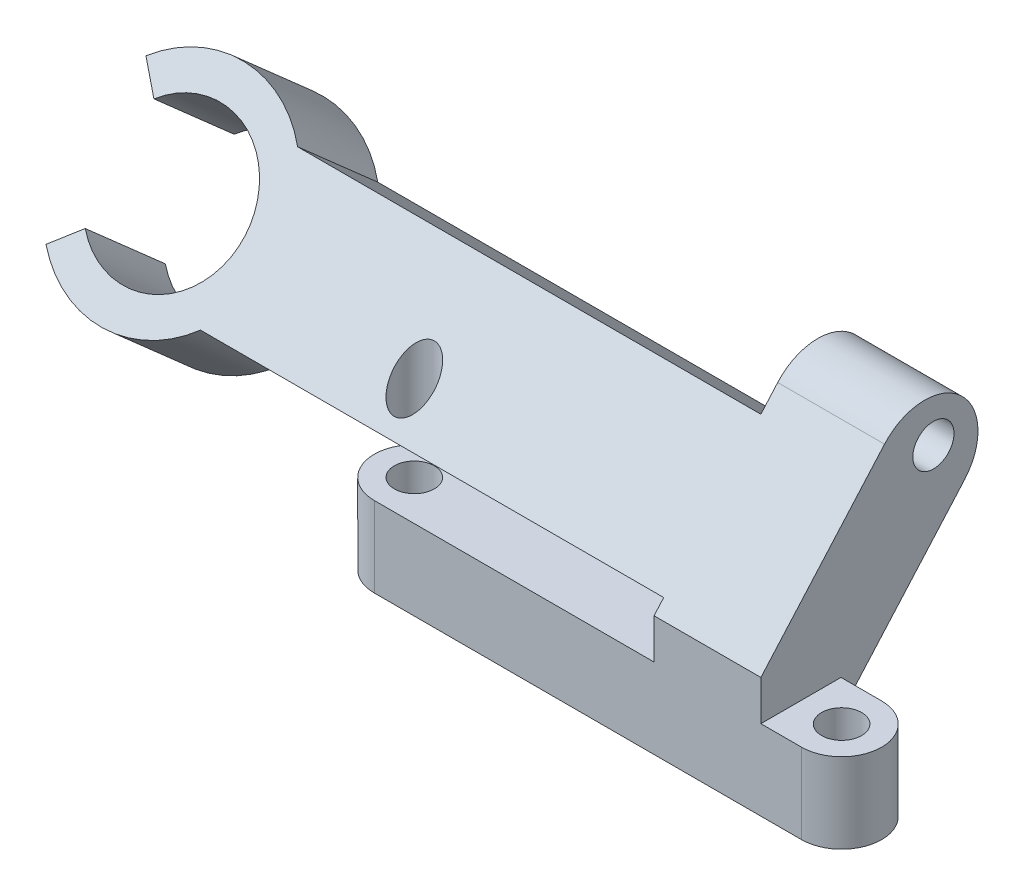
ISO-10303-21;
HEADER;
FILE_DESCRIPTION(('STEP AP214'),'2;1');
FILE_NAME('part.step','',(''),(''),'','','');
FILE_SCHEMA(('AUTOMOTIVE_DESIGN { 1 0 10303 214 1 1 1 1 }'));
ENDSEC;
DATA;
#1=APPLICATION_CONTEXT('core data for automotive mechanical design processes');
#2=APPLICATION_PROTOCOL_DEFINITION('international standard','automotive_design',2000,#1);
#3=PRODUCT_CONTEXT('',#1,'mechanical');
#4=PRODUCT('Part','Part','',(#3));
#5=PRODUCT_RELATED_PRODUCT_CATEGORY('part','',(#4));
#6=PRODUCT_DEFINITION_FORMATION('','',#4);
#7=PRODUCT_DEFINITION_CONTEXT('part definition',#1,'design');
#8=PRODUCT_DEFINITION('design','',#6,#7);
#9=PRODUCT_DEFINITION_SHAPE('','',#8);
#10=(LENGTH_UNIT() NAMED_UNIT(*) SI_UNIT(.MILLI.,.METRE.));
#11=(NAMED_UNIT(*) PLANE_ANGLE_UNIT() SI_UNIT($,.RADIAN.));
#12=(NAMED_UNIT(*) SI_UNIT($,.STERADIAN.) SOLID_ANGLE_UNIT());
#13=UNCERTAINTY_MEASURE_WITH_UNIT(LENGTH_MEASURE(1.E-05),#10,'distance_accuracy_value','');
#14=(GEOMETRIC_REPRESENTATION_CONTEXT(3) GLOBAL_UNCERTAINTY_ASSIGNED_CONTEXT((#13)) GLOBAL_UNIT_ASSIGNED_CONTEXT((#10,
#11,#12)) REPRESENTATION_CONTEXT('',''));
#15=CARTESIAN_POINT('',(0.,0.,0.));
#16=DIRECTION('',(0.,0.,1.));
#17=DIRECTION('',(1.,0.,0.));
#18=AXIS2_PLACEMENT_3D('',#15,#16,#17);
#19=CARTESIAN_POINT('',(0.,-6.,-3.));
#20=DIRECTION('',(0.,0.,1.));
#21=DIRECTION('',(1.,0.,0.));
#22=AXIS2_PLACEMENT_3D('',#19,#20,#21);
#23=PLANE('',#22);
#24=DIRECTION('',(-1.,0.,0.));
#25=VECTOR('',#24,1.);
#26=CARTESIAN_POINT('',(0.,-0.833438766914098,-3.));
#27=LINE('',#26,#25);
#28=CARTESIAN_POINT('',(-17.7227582561547,-0.833438766914098,-3.));
#29=VERTEX_POINT('',#28);
#30=CARTESIAN_POINT('',(-38.6769688873375,-0.833438766914098,-3.));
#31=VERTEX_POINT('',#30);
#32=EDGE_CURVE('E235',#29,#31,#27,.T.);
#33=ORIENTED_EDGE('',*,*,#32,.F.);
#34=DIRECTION('',(0.,1.,0.));
#35=VECTOR('',#34,1.);
#36=CARTESIAN_POINT('',(-17.7227582561547,-6.,-3.));
#37=LINE('',#36,#35);
#38=CARTESIAN_POINT('',(-17.7227582561547,-2.2915026221292,-3.));
#39=VERTEX_POINT('',#38);
#40=EDGE_CURVE('E272',#39,#29,#37,.T.);
#41=ORIENTED_EDGE('',*,*,#40,.F.);
#42=DIRECTION('',(1.,0.,0.));
#43=VECTOR('',#42,1.);
#44=CARTESIAN_POINT('',(-17.7227582561547,-2.2915026221292,-3.));
#45=LINE('',#44,#43);
#46=CARTESIAN_POINT('',(-9.72275825615475,-2.2915026221292,-3.));
#47=VERTEX_POINT('',#46);
#48=EDGE_CURVE('E249',#39,#47,#45,.T.);
#49=ORIENTED_EDGE('',*,*,#48,.T.);
#50=DIRECTION('',(0.,1.,0.));
#51=VECTOR('',#50,1.);
#52=CARTESIAN_POINT('',(-9.72275825615475,-6.,-3.));
#53=LINE('',#52,#51);
#54=CARTESIAN_POINT('',(-9.72275825615475,0.,-3.));
#55=VERTEX_POINT('',#54);
#56=EDGE_CURVE('E252',#47,#55,#53,.T.);
#57=ORIENTED_EDGE('',*,*,#56,.T.);
#58=DIRECTION('',(1.,0.,0.));
#59=VECTOR('',#58,1.);
#60=CARTESIAN_POINT('',(0.,0.,-3.));
#61=LINE('',#60,#59);
#62=CARTESIAN_POINT('',(-6.67696888733747,0.,-3.));
#63=VERTEX_POINT('',#62);
#64=EDGE_CURVE('E321',#55,#63,#61,.T.);
#65=ORIENTED_EDGE('',*,*,#64,.T.);
#66=DIRECTION('',(0.,1.,0.));
#67=VECTOR('',#66,1.);
#68=CARTESIAN_POINT('',(-6.67696888733747,-6.,-3.));
#69=LINE('',#68,#67);
#70=CARTESIAN_POINT('',(-6.67696888733747,-6.,-3.));
#71=VERTEX_POINT('',#70);
#72=EDGE_CURVE('E339',#71,#63,#69,.T.);
#73=ORIENTED_EDGE('',*,*,#72,.F.);
#74=DIRECTION('',(1.,0.,0.));
#75=VECTOR('',#74,1.);
#76=CARTESIAN_POINT('',(0.,-6.,-3.));
#77=LINE('',#76,#75);
#78=CARTESIAN_POINT('',(-38.6769688873375,-6.,-3.));
#79=VERTEX_POINT('',#78);
#80=EDGE_CURVE('E356',#79,#71,#77,.T.);
#81=ORIENTED_EDGE('',*,*,#80,.F.);
#82=DIRECTION('',(0.,1.,0.));
#83=VECTOR('',#82,1.);
#84=CARTESIAN_POINT('',(-38.6769688873375,-6.,-3.));
#85=LINE('',#84,#83);
#86=EDGE_CURVE('E336',#79,#31,#85,.T.);
#87=ORIENTED_EDGE('',*,*,#86,.T.);
#88=EDGE_LOOP('',(#33,#41,#49,#57,#65,#73,#81,#87));
#89=FACE_BOUND('',#88,.T.);
#90=ADVANCED_FACE('F53',(#89),#23,.F.);
#91=CARTESIAN_POINT('',(-38.6769688873375,-6.,0.));
#92=DIRECTION('',(0.,1.,0.));
#93=DIRECTION('',(0.,0.,1.));
#94=AXIS2_PLACEMENT_3D('',#91,#92,#93);
#95=CYLINDRICAL_SURFACE('',#94,3.);
#96=CARTESIAN_POINT('',(-38.6769688873375,0.,0.));
#97=DIRECTION('',(0.,1.,0.));
#98=DIRECTION('',(0.,0.,1.));
#99=AXIS2_PLACEMENT_3D('',#96,#97,#98);
#100=CIRCLE('',#99,3.);
#101=CARTESIAN_POINT('',(-40.8626269830943,0.,-2.05496926703356));
#102=VERTEX_POINT('',#101);
#103=CARTESIAN_POINT('',(-38.6769688873375,0.,3.));
#104=VERTEX_POINT('',#103);
#105=EDGE_CURVE('E313',#102,#104,#100,.T.);
#106=ORIENTED_EDGE('',*,*,#105,.F.);
#107=CARTESIAN_POINT('',(-38.6769688873375,1.8123125441505,0.));
#108=DIRECTION('',(0.,0.749999999999999,-0.661437827766149));
#109=DIRECTION('',(0.,0.661437827766149,0.749999999999999));
#110=AXIS2_PLACEMENT_3D('',#107,#108,#109);
#111=ELLIPSE('',#110,4.00000000000001,3.);
#112=EDGE_CURVE('E233',#102,#31,#111,.F.);
#113=ORIENTED_EDGE('',*,*,#112,.T.);
#114=ORIENTED_EDGE('',*,*,#86,.F.);
#115=CARTESIAN_POINT('',(-38.6769688873375,-6.,0.));
#116=DIRECTION('',(0.,1.,0.));
#117=DIRECTION('',(0.,0.,1.));
#118=AXIS2_PLACEMENT_3D('',#115,#116,#117);
#119=CIRCLE('',#118,3.);
#120=CARTESIAN_POINT('',(-38.6769688873375,-6.,3.));
#121=VERTEX_POINT('',#120);
#122=EDGE_CURVE('E353',#79,#121,#119,.T.);
#123=ORIENTED_EDGE('',*,*,#122,.T.);
#124=DIRECTION('',(0.,1.,0.));
#125=VECTOR('',#124,1.);
#126=CARTESIAN_POINT('',(-38.6769688873375,-6.,3.));
#127=LINE('',#126,#125);
#128=EDGE_CURVE('E62',#121,#104,#127,.T.);
#129=ORIENTED_EDGE('',*,*,#128,.T.);
#130=EDGE_LOOP('',(#106,#113,#114,#123,#129));
#131=FACE_BOUND('',#130,.T.);
#132=ADVANCED_FACE('F370',(#131),#95,.T.);
#133=CARTESIAN_POINT('',(0.,0.,0.));
#134=DIRECTION('',(0.,1.,0.));
#135=DIRECTION('',(0.,0.,1.));
#136=AXIS2_PLACEMENT_3D('',#133,#134,#135);
#137=PLANE('',#136);
#138=CARTESIAN_POINT('',(-38.6769688873375,0.,0.));
#139=DIRECTION('',(0.,1.,0.));
#140=DIRECTION('',(0.,0.,1.));
#141=AXIS2_PLACEMENT_3D('',#138,#139,#140);
#142=CIRCLE('',#141,1.5);
#143=CARTESIAN_POINT('',(-38.6769688873375,0.,1.5));
#144=VERTEX_POINT('',#143);
#145=EDGE_CURVE('E328',#144,#144,#142,.T.);
#146=ORIENTED_EDGE('',*,*,#145,.F.);
#147=EDGE_LOOP('',(#146));
#148=FACE_BOUND('',#147,.T.);
#149=DIRECTION('',(0.,0.,1.));
#150=VECTOR('',#149,1.);
#151=CARTESIAN_POINT('',(-17.7227582561547,0.,0.));
#152=LINE('',#151,#150);
#153=CARTESIAN_POINT('',(-17.7227582561547,0.,-2.05496926703356));
#154=VERTEX_POINT('',#153);
#155=CARTESIAN_POINT('',(-17.7227582561547,0.,3.));
#156=VERTEX_POINT('',#155);
#157=EDGE_CURVE('E282',#154,#156,#152,.T.);
#158=ORIENTED_EDGE('',*,*,#157,.F.);
#159=DIRECTION('',(-1.,0.,0.));
#160=VECTOR('',#159,1.);
#161=CARTESIAN_POINT('',(0.,0.,-2.05496926703356));
#162=LINE('',#161,#160);
#163=EDGE_CURVE('E231',#154,#102,#162,.T.);
#164=ORIENTED_EDGE('',*,*,#163,.T.);
#165=ORIENTED_EDGE('',*,*,#105,.T.);
#166=DIRECTION('',(1.,0.,0.));
#167=VECTOR('',#166,1.);
#168=CARTESIAN_POINT('',(0.,0.,3.));
#169=LINE('',#168,#167);
#170=EDGE_CURVE('E310',#104,#156,#169,.T.);
#171=ORIENTED_EDGE('',*,*,#170,.T.);
#172=EDGE_LOOP('',(#158,#164,#165,#171));
#173=FACE_BOUND('',#172,.T.);
#174=ADVANCED_FACE('F311',(#148,#173),#137,.T.);
#175=CARTESIAN_POINT('',(-17.7227582561547,3.,0.));
#176=DIRECTION('',(1.,0.,0.));
#177=DIRECTION('',(0.,0.,-1.));
#178=AXIS2_PLACEMENT_3D('',#175,#176,#177);
#179=PLANE('',#178);
#180=DIRECTION('',(0.,0.661437827766149,0.749999999999999));
#181=VECTOR('',#180,1.);
#182=CARTESIAN_POINT('',(-17.7227582561547,-1.47134170357071,-3.72331394185336));
#183=LINE('',#182,#181);
#184=CARTESIAN_POINT('',(-17.7227582561547,-1.47134170357071,-3.72331394185336));
#185=VERTEX_POINT('',#184);
#186=EDGE_CURVE('E218',#185,#29,#183,.T.);
#187=ORIENTED_EDGE('',*,*,#186,.F.);
#188=DIRECTION('',(0.,-0.749999999999999,0.661437827766149));
#189=VECTOR('',#188,1.);
#190=CARTESIAN_POINT('',(-17.7227582561547,8.20849737787078,-12.2601295887261));
#191=LINE('',#190,#189);
#192=EDGE_CURVE('E258',#185,#39,#191,.T.);
#193=ORIENTED_EDGE('',*,*,#192,.T.);
#194=ORIENTED_EDGE('',*,*,#40,.T.);
#195=EDGE_LOOP('',(#187,#193,#194));
#196=FACE_BOUND('',#195,.T.);
#197=ADVANCED_FACE('F394',(#196),#179,.F.);
#198=CARTESIAN_POINT('',(-17.7227582561547,3.82016091855849,2.27668605814664));
#199=VERTEX_POINT('',#198);
#200=EDGE_CURVE('E216',#154,#199,#183,.T.);
#201=ORIENTED_EDGE('',*,*,#200,.F.);
#202=ORIENTED_EDGE('',*,*,#157,.T.);
#203=DIRECTION('',(0.,-1.,0.));
#204=VECTOR('',#203,1.);
#205=CARTESIAN_POINT('',(-17.7227582561547,3.,3.));
#206=LINE('',#205,#204);
#207=CARTESIAN_POINT('',(-17.7227582561547,3.,3.));
#208=VERTEX_POINT('',#207);
#209=EDGE_CURVE('E294',#208,#156,#206,.T.);
#210=ORIENTED_EDGE('',*,*,#209,.F.);
#211=DIRECTION('',(0.,-0.749999999999999,0.661437827766149));
#212=VECTOR('',#211,1.);
#213=CARTESIAN_POINT('',(-17.7227582561547,13.5,-6.26012958872609));
#214=LINE('',#213,#212);
#215=EDGE_CURVE('E257',#199,#208,#214,.T.);
#216=ORIENTED_EDGE('',*,*,#215,.F.);
#217=EDGE_LOOP('',(#201,#202,#210,#216));
#218=FACE_BOUND('',#217,.T.);
#219=ADVANCED_FACE('F303',(#218),#179,.F.);
#220=CARTESIAN_POINT('',(-17.7227582561547,11.6042486889354,-9.92156741649224));
#221=DIRECTION('',(1.,0.,0.));
#222=DIRECTION('',(0.,0.,-1.));
#223=AXIS2_PLACEMENT_3D('',#220,#221,#222);
#224=CIRCLE('',#223,1.54236434065057);
#225=CARTESIAN_POINT('',(-17.7227582561547,11.6042486889354,-11.4639317571428));
#226=VERTEX_POINT('',#225);
#227=EDGE_CURVE('E241',#226,#226,#224,.T.);
#228=ORIENTED_EDGE('',*,*,#227,.T.);
#229=EDGE_LOOP('',(#228));
#230=FACE_BOUND('',#229,.T.);
#231=DIRECTION('',(0.,-0.661437827766149,-0.749999999999999));
#232=VECTOR('',#231,1.);
#233=CARTESIAN_POINT('',(-17.7227582561547,6.77865829642928,-10.999130047281));
#234=LINE('',#233,#232);
#235=CARTESIAN_POINT('',(-17.7227582561547,12.0701609185585,-4.999130047281));
#236=VERTEX_POINT('',#235);
#237=CARTESIAN_POINT('',(-17.7227582561547,6.77865829642927,-10.999130047281));
#238=VERTEX_POINT('',#237);
#239=EDGE_CURVE('E221',#236,#238,#234,.T.);
#240=ORIENTED_EDGE('',*,*,#239,.F.);
#241=CARTESIAN_POINT('',(-17.7227582561547,13.5,-6.26012958872609));
#242=VERTEX_POINT('',#241);
#243=EDGE_CURVE('E259',#242,#236,#214,.T.);
#244=ORIENTED_EDGE('',*,*,#243,.F.);
#245=CARTESIAN_POINT('',(-17.7227582561547,10.8542486889354,-9.26012958872609));
#246=DIRECTION('',(1.,0.,0.));
#247=DIRECTION('',(0.,0.,-1.));
#248=AXIS2_PLACEMENT_3D('',#245,#246,#247);
#249=CIRCLE('',#248,4.);
#250=CARTESIAN_POINT('',(-17.7227582561547,8.20849737787078,-12.2601295887261));
#251=VERTEX_POINT('',#250);
#252=EDGE_CURVE('E242',#251,#242,#249,.T.);
#253=ORIENTED_EDGE('',*,*,#252,.F.);
#254=EDGE_CURVE('E254',#251,#238,#191,.T.);
#255=ORIENTED_EDGE('',*,*,#254,.T.);
#256=EDGE_LOOP('',(#240,#244,#253,#255));
#257=FACE_BOUND('',#256,.T.);
#258=ADVANCED_FACE('F404',(#230,#257),#179,.F.);
#259=CARTESIAN_POINT('',(-6.67696888733747,0.,0.));
#260=DIRECTION('',(0.,1.,0.));
#261=DIRECTION('',(0.,0.,1.));
#262=AXIS2_PLACEMENT_3D('',#259,#260,#261);
#263=CIRCLE('',#262,1.5);
#264=CARTESIAN_POINT('',(-6.67696888733747,0.,1.5));
#265=VERTEX_POINT('',#264);
#266=EDGE_CURVE('E331',#265,#265,#263,.T.);
#267=ORIENTED_EDGE('',*,*,#266,.F.);
#268=EDGE_LOOP('',(#267));
#269=FACE_BOUND('',#268,.T.);
#270=ORIENTED_EDGE('',*,*,#64,.F.);
#271=DIRECTION('',(0.,0.,1.));
#272=VECTOR('',#271,1.);
#273=CARTESIAN_POINT('',(-9.72275825615475,0.,0.));
#274=LINE('',#273,#272);
#275=CARTESIAN_POINT('',(-9.72275825615475,0.,3.));
#276=VERTEX_POINT('',#275);
#277=EDGE_CURVE('E277',#55,#276,#274,.T.);
#278=ORIENTED_EDGE('',*,*,#277,.T.);
#279=CARTESIAN_POINT('',(-6.67696888733747,0.,3.));
#280=VERTEX_POINT('',#279);
#281=EDGE_CURVE('E317',#276,#280,#169,.T.);
#282=ORIENTED_EDGE('',*,*,#281,.T.);
#283=CARTESIAN_POINT('',(-6.67696888733747,0.,0.));
#284=DIRECTION('',(0.,1.,0.));
#285=DIRECTION('',(0.,0.,1.));
#286=AXIS2_PLACEMENT_3D('',#283,#284,#285);
#287=CIRCLE('',#286,3.);
#288=EDGE_CURVE('E316',#280,#63,#287,.T.);
#289=ORIENTED_EDGE('',*,*,#288,.T.);
#290=EDGE_LOOP('',(#270,#278,#282,#289));
#291=FACE_BOUND('',#290,.T.);
#292=ADVANCED_FACE('F380',(#269,#291),#137,.T.);
#293=CARTESIAN_POINT('',(0.,-6.,3.));
#294=DIRECTION('',(0.,0.,1.));
#295=DIRECTION('',(1.,0.,0.));
#296=AXIS2_PLACEMENT_3D('',#293,#294,#295);
#297=PLANE('',#296);
#298=ORIENTED_EDGE('',*,*,#170,.F.);
#299=ORIENTED_EDGE('',*,*,#128,.F.);
#300=DIRECTION('',(1.,0.,0.));
#301=VECTOR('',#300,1.);
#302=CARTESIAN_POINT('',(0.,-6.,3.));
#303=LINE('',#302,#301);
#304=CARTESIAN_POINT('',(-6.67696888733747,-6.,3.));
#305=VERTEX_POINT('',#304);
#306=EDGE_CURVE('E334',#121,#305,#303,.T.);
#307=ORIENTED_EDGE('',*,*,#306,.T.);
#308=DIRECTION('',(0.,1.,0.));
#309=VECTOR('',#308,1.);
#310=CARTESIAN_POINT('',(-6.67696888733747,-6.,3.));
#311=LINE('',#310,#309);
#312=EDGE_CURVE('E342',#305,#280,#311,.T.);
#313=ORIENTED_EDGE('',*,*,#312,.T.);
#314=ORIENTED_EDGE('',*,*,#281,.F.);
#315=DIRECTION('',(0.,-1.,0.));
#316=VECTOR('',#315,1.);
#317=CARTESIAN_POINT('',(-9.72275825615475,3.,3.));
#318=LINE('',#317,#316);
#319=CARTESIAN_POINT('',(-9.72275825615475,3.,3.));
#320=VERTEX_POINT('',#319);
#321=EDGE_CURVE('E281',#320,#276,#318,.T.);
#322=ORIENTED_EDGE('',*,*,#321,.F.);
#323=DIRECTION('',(1.,0.,0.));
#324=VECTOR('',#323,1.);
#325=CARTESIAN_POINT('',(0.,3.,3.));
#326=LINE('',#325,#324);
#327=EDGE_CURVE('E278',#208,#320,#326,.T.);
#328=ORIENTED_EDGE('',*,*,#327,.F.);
#329=ORIENTED_EDGE('',*,*,#209,.T.);
#330=EDGE_LOOP('',(#298,#299,#307,#313,#314,#322,#328,#329));
#331=FACE_BOUND('',#330,.T.);
#332=ADVANCED_FACE('F55',(#331),#297,.T.);
#333=CARTESIAN_POINT('',(-38.6769688873375,-6.,0.));
#334=DIRECTION('',(0.,1.,0.));
#335=DIRECTION('',(0.,0.,1.));
#336=AXIS2_PLACEMENT_3D('',#333,#334,#335);
#337=CYLINDRICAL_SURFACE('',#336,1.5);
#338=CARTESIAN_POINT('',(-38.6769688873375,-6.,0.));
#339=DIRECTION('',(0.,1.,0.));
#340=DIRECTION('',(0.,0.,1.));
#341=AXIS2_PLACEMENT_3D('',#338,#339,#340);
#342=CIRCLE('',#341,1.5);
#343=CARTESIAN_POINT('',(-38.6769688873375,-6.,1.5));
#344=VERTEX_POINT('',#343);
#345=EDGE_CURVE('E350',#344,#344,#342,.T.);
#346=ORIENTED_EDGE('',*,*,#345,.F.);
#347=EDGE_LOOP('',(#346));
#348=FACE_BOUND('',#347,.T.);
#349=ORIENTED_EDGE('',*,*,#145,.T.);
#350=EDGE_LOOP('',(#349));
#351=FACE_BOUND('',#350,.T.);
#352=ADVANCED_FACE('F456',(#348,#351),#337,.F.);
#353=CARTESIAN_POINT('',(-6.67696888733747,-6.,0.));
#354=DIRECTION('',(0.,1.,0.));
#355=DIRECTION('',(0.,0.,1.));
#356=AXIS2_PLACEMENT_3D('',#353,#354,#355);
#357=CYLINDRICAL_SURFACE('',#356,3.);
#358=ORIENTED_EDGE('',*,*,#288,.F.);
#359=ORIENTED_EDGE('',*,*,#312,.F.);
#360=CARTESIAN_POINT('',(-6.67696888733747,-6.,0.));
#361=DIRECTION('',(0.,1.,0.));
#362=DIRECTION('',(0.,0.,1.));
#363=AXIS2_PLACEMENT_3D('',#360,#361,#362);
#364=CIRCLE('',#363,3.);
#365=EDGE_CURVE('E358',#305,#71,#364,.T.);
#366=ORIENTED_EDGE('',*,*,#365,.T.);
#367=ORIENTED_EDGE('',*,*,#72,.T.);
#368=EDGE_LOOP('',(#358,#359,#366,#367));
#369=FACE_BOUND('',#368,.T.);
#370=ADVANCED_FACE('F378',(#369),#357,.T.);
#371=CARTESIAN_POINT('',(-6.67696888733747,-6.,0.));
#372=DIRECTION('',(0.,1.,0.));
#373=DIRECTION('',(0.,0.,1.));
#374=AXIS2_PLACEMENT_3D('',#371,#372,#373);
#375=CYLINDRICAL_SURFACE('',#374,1.5);
#376=CARTESIAN_POINT('',(-6.67696888733747,-6.,0.));
#377=DIRECTION('',(0.,1.,0.));
#378=DIRECTION('',(0.,0.,1.));
#379=AXIS2_PLACEMENT_3D('',#376,#377,#378);
#380=CIRCLE('',#379,1.5);
#381=CARTESIAN_POINT('',(-6.67696888733747,-6.,1.5));
#382=VERTEX_POINT('',#381);
#383=EDGE_CURVE('E344',#382,#382,#380,.T.);
#384=ORIENTED_EDGE('',*,*,#383,.F.);
#385=EDGE_LOOP('',(#384));
#386=FACE_BOUND('',#385,.T.);
#387=ORIENTED_EDGE('',*,*,#266,.T.);
#388=EDGE_LOOP('',(#387));
#389=FACE_BOUND('',#388,.T.);
#390=ADVANCED_FACE('F455',(#386,#389),#375,.F.);
#391=CARTESIAN_POINT('',(0.,-6.,0.));
#392=DIRECTION('',(0.,1.,0.));
#393=DIRECTION('',(0.,0.,1.));
#394=AXIS2_PLACEMENT_3D('',#391,#392,#393);
#395=PLANE('',#394);
#396=ORIENTED_EDGE('',*,*,#306,.F.);
#397=ORIENTED_EDGE('',*,*,#122,.F.);
#398=ORIENTED_EDGE('',*,*,#80,.T.);
#399=ORIENTED_EDGE('',*,*,#365,.F.);
#400=EDGE_LOOP('',(#396,#397,#398,#399));
#401=FACE_BOUND('',#400,.T.);
#402=ORIENTED_EDGE('',*,*,#345,.T.);
#403=EDGE_LOOP('',(#402));
#404=FACE_BOUND('',#403,.T.);
#405=ORIENTED_EDGE('',*,*,#383,.T.);
#406=EDGE_LOOP('',(#405));
#407=FACE_BOUND('',#406,.T.);
#408=ADVANCED_FACE('F367',(#401,#404,#407),#395,.F.);
#409=CARTESIAN_POINT('',(-9.72275825615475,3.,0.));
#410=DIRECTION('',(1.,0.,0.));
#411=DIRECTION('',(0.,0.,-1.));
#412=AXIS2_PLACEMENT_3D('',#409,#410,#411);
#413=PLANE('',#412);
#414=CARTESIAN_POINT('',(-9.72275825615475,11.6042486889354,-9.92156741649224));
#415=DIRECTION('',(1.,0.,0.));
#416=DIRECTION('',(0.,0.,-1.));
#417=AXIS2_PLACEMENT_3D('',#414,#415,#416);
#418=CIRCLE('',#417,1.54236434065057);
#419=CARTESIAN_POINT('',(-9.72275825615475,11.6042486889354,-11.4639317571428));
#420=VERTEX_POINT('',#419);
#421=EDGE_CURVE('E238',#420,#420,#418,.T.);
#422=ORIENTED_EDGE('',*,*,#421,.F.);
#423=EDGE_LOOP('',(#422));
#424=FACE_BOUND('',#423,.T.);
#425=ORIENTED_EDGE('',*,*,#277,.F.);
#426=ORIENTED_EDGE('',*,*,#56,.F.);
#427=DIRECTION('',(0.,-0.749999999999999,0.661437827766149));
#428=VECTOR('',#427,1.);
#429=CARTESIAN_POINT('',(-9.72275825615475,8.20849737787078,-12.2601295887261));
#430=LINE('',#429,#428);
#431=CARTESIAN_POINT('',(-9.72275825615475,8.20849737787078,-12.2601295887261));
#432=VERTEX_POINT('',#431);
#433=EDGE_CURVE('E262',#432,#47,#430,.T.);
#434=ORIENTED_EDGE('',*,*,#433,.F.);
#435=CARTESIAN_POINT('',(-9.72275825615475,10.8542486889354,-9.26012958872609));
#436=DIRECTION('',(1.,0.,0.));
#437=DIRECTION('',(0.,0.,-1.));
#438=AXIS2_PLACEMENT_3D('',#435,#436,#437);
#439=CIRCLE('',#438,4.);
#440=CARTESIAN_POINT('',(-9.72275825615475,13.5,-6.26012958872609));
#441=VERTEX_POINT('',#440);
#442=EDGE_CURVE('E246',#432,#441,#439,.T.);
#443=ORIENTED_EDGE('',*,*,#442,.T.);
#444=DIRECTION('',(0.,-0.749999999999999,0.661437827766149));
#445=VECTOR('',#444,1.);
#446=CARTESIAN_POINT('',(-9.72275825615475,13.5,-6.26012958872609));
#447=LINE('',#446,#445);
#448=EDGE_CURVE('E265',#441,#320,#447,.T.);
#449=ORIENTED_EDGE('',*,*,#448,.T.);
#450=ORIENTED_EDGE('',*,*,#321,.T.);
#451=EDGE_LOOP('',(#425,#426,#434,#443,#449,#450));
#452=FACE_BOUND('',#451,.T.);
#453=ADVANCED_FACE('F383',(#424,#452),#413,.T.);
#454=CARTESIAN_POINT('',(-17.7227582561547,10.8542486889354,-9.26012958872609));
#455=DIRECTION('',(1.,0.,0.));
#456=DIRECTION('',(0.,0.,-1.));
#457=AXIS2_PLACEMENT_3D('',#454,#455,#456);
#458=CYLINDRICAL_SURFACE('',#457,4.);
#459=ORIENTED_EDGE('',*,*,#442,.F.);
#460=DIRECTION('',(1.,0.,0.));
#461=VECTOR('',#460,1.);
#462=CARTESIAN_POINT('',(-17.7227582561547,8.20849737787078,-12.2601295887261));
#463=LINE('',#462,#461);
#464=EDGE_CURVE('E245',#251,#432,#463,.T.);
#465=ORIENTED_EDGE('',*,*,#464,.F.);
#466=ORIENTED_EDGE('',*,*,#252,.T.);
#467=DIRECTION('',(1.,0.,0.));
#468=VECTOR('',#467,1.);
#469=CARTESIAN_POINT('',(-17.7227582561547,13.5,-6.26012958872609));
#470=LINE('',#469,#468);
#471=EDGE_CURVE('E250',#242,#441,#470,.T.);
#472=ORIENTED_EDGE('',*,*,#471,.T.);
#473=EDGE_LOOP('',(#459,#465,#466,#472));
#474=FACE_BOUND('',#473,.T.);
#475=ADVANCED_FACE('F399',(#474),#458,.T.);
#476=CARTESIAN_POINT('',(-17.7227582561547,13.5,-6.26012958872609));
#477=DIRECTION('',(0.,0.661437827766149,0.749999999999999));
#478=DIRECTION('',(0.,-0.749999999999999,0.661437827766149));
#479=AXIS2_PLACEMENT_3D('',#476,#477,#478);
#480=PLANE('',#479);
#481=CARTESIAN_POINT('',(-38.6769688873375,6.40168025708303,0.));
#482=DIRECTION('',(0.,0.661437827766149,0.749999999999999));
#483=DIRECTION('',(0.,-0.749999999999999,0.661437827766149));
#484=AXIS2_PLACEMENT_3D('',#481,#482,#483);
#485=ELLIPSE('',#484,2.26778683805536,1.5);
#486=CARTESIAN_POINT('',(-38.6769688873375,4.70084012854151,1.5));
#487=VERTEX_POINT('',#486);
#488=EDGE_CURVE('E414',#487,#487,#485,.T.);
#489=ORIENTED_EDGE('',*,*,#488,.F.);
#490=EDGE_LOOP('',(#489));
#491=FACE_BOUND('',#490,.T.);
#492=DIRECTION('',(1.,0.,0.));
#493=VECTOR('',#492,1.);
#494=CARTESIAN_POINT('',(-52.7227582561548,12.0701609185585,-4.999130047281));
#495=LINE('',#494,#493);
#496=CARTESIAN_POINT('',(-52.4132832368436,12.0701609185585,-4.999130047281));
#497=VERTEX_POINT('',#496);
#498=EDGE_CURVE('E226',#497,#236,#495,.T.);
#499=ORIENTED_EDGE('',*,*,#498,.F.);
#500=CARTESIAN_POINT('',(-58.2227582561547,7.94516091855847,-1.36122199456719));
#501=DIRECTION('',(0.,-0.661437827766149,-0.749999999999999));
#502=DIRECTION('',(0.,0.749999999999999,-0.661437827766149));
#503=AXIS2_PLACEMENT_3D('',#500,#501,#502);
#504=CIRCLE('',#503,8.);
#505=CARTESIAN_POINT('',(-63.8796125056471,12.1878016056778,-5.10287938134116));
#506=VERTEX_POINT('',#505);
#507=EDGE_CURVE('E190',#506,#497,#504,.T.);
#508=ORIENTED_EDGE('',*,*,#507,.F.);
#509=DIRECTION('',(-0.707106781186546,0.530330085889911,-0.467707173346745));
#510=VECTOR('',#509,1.);
#511=CARTESIAN_POINT('',(-25.6817619240211,-16.4605863305419,20.1626239327056));
#512=LINE('',#511,#510);
#513=CARTESIAN_POINT('',(-62.1118455526808,10.861976390953,-3.9336114479743));
#514=VERTEX_POINT('',#513);
#515=EDGE_CURVE('E207',#514,#506,#512,.T.);
#516=ORIENTED_EDGE('',*,*,#515,.F.);
#517=CARTESIAN_POINT('',(-58.2227582561547,7.94516091855847,-1.36122199456719));
#518=DIRECTION('',(0.,-0.661437827766149,-0.749999999999999));
#519=DIRECTION('',(0.,0.749999999999999,-0.661437827766149));
#520=AXIS2_PLACEMENT_3D('',#517,#518,#519);
#521=CIRCLE('',#520,5.50000000000001);
#522=CARTESIAN_POINT('',(-62.1118455526808,5.02834544616396,1.2111674588399));
#523=VERTEX_POINT('',#522);
#524=EDGE_CURVE('E198',#514,#523,#521,.T.);
#525=ORIENTED_EDGE('',*,*,#524,.T.);
#526=DIRECTION('',(-0.707106781186547,-0.53033008588991,0.467707173346744));
#527=VECTOR('',#526,1.);
#528=CARTESIAN_POINT('',(-32.5409963321339,27.2064823615741,-18.348110814799));
#529=LINE('',#528,#527);
#530=CARTESIAN_POINT('',(-63.8796125056471,3.70252023143919,2.38043539220676));
#531=VERTEX_POINT('',#530);
#532=EDGE_CURVE('E194',#523,#531,#529,.T.);
#533=ORIENTED_EDGE('',*,*,#532,.T.);
#534=CARTESIAN_POINT('',(-52.4132832368436,3.82016091855849,2.27668605814664));
#535=VERTEX_POINT('',#534);
#536=EDGE_CURVE('E182',#535,#531,#504,.T.);
#537=ORIENTED_EDGE('',*,*,#536,.F.);
#538=DIRECTION('',(1.,0.,0.));
#539=VECTOR('',#538,1.);
#540=CARTESIAN_POINT('',(-52.7227582561548,3.82016091855849,2.27668605814664));
#541=LINE('',#540,#539);
#542=EDGE_CURVE('E74',#535,#199,#541,.T.);
#543=ORIENTED_EDGE('',*,*,#542,.T.);
#544=ORIENTED_EDGE('',*,*,#215,.T.);
#545=ORIENTED_EDGE('',*,*,#327,.T.);
#546=ORIENTED_EDGE('',*,*,#448,.F.);
#547=ORIENTED_EDGE('',*,*,#471,.F.);
#548=ORIENTED_EDGE('',*,*,#243,.T.);
#549=EDGE_LOOP('',(#499,#508,#516,#525,#533,#537,#543,#544,#545,#546,#547,#548));
#550=FACE_BOUND('',#549,.T.);
#551=ADVANCED_FACE('F196',(#491,#550),#480,.T.);
#552=CARTESIAN_POINT('',(-17.7227582561547,8.20849737787078,-12.2601295887261));
#553=DIRECTION('',(0.,0.661437827766149,0.749999999999999));
#554=DIRECTION('',(0.,-0.749999999999999,0.661437827766149));
#555=AXIS2_PLACEMENT_3D('',#552,#553,#554);
#556=PLANE('',#555);
#557=DIRECTION('',(1.,0.,0.));
#558=VECTOR('',#557,1.);
#559=CARTESIAN_POINT('',(-52.7227582561548,-1.47134170357071,-3.72331394185336));
#560=LINE('',#559,#558);
#561=CARTESIAN_POINT('',(-52.4132832368436,-1.47134170357071,-3.72331394185336));
#562=VERTEX_POINT('',#561);
#563=EDGE_CURVE('E229',#562,#185,#560,.T.);
#564=ORIENTED_EDGE('',*,*,#563,.F.);
#565=CARTESIAN_POINT('',(-58.2227582561547,2.65365829642928,-7.36122199456718));
#566=DIRECTION('',(0.,-0.661437827766149,-0.749999999999999));
#567=DIRECTION('',(0.,0.749999999999999,-0.661437827766149));
#568=AXIS2_PLACEMENT_3D('',#565,#566,#567);
#569=CIRCLE('',#568,8.);
#570=CARTESIAN_POINT('',(-63.8796125056471,-1.58898239069,-3.61956460779323));
#571=VERTEX_POINT('',#570);
#572=EDGE_CURVE('E419',#562,#571,#569,.T.);
#573=ORIENTED_EDGE('',*,*,#572,.T.);
#574=DIRECTION('',(-0.707106781186547,-0.53033008588991,0.467707173346744));
#575=VECTOR('',#574,1.);
#576=CARTESIAN_POINT('',(-32.5409963321339,21.9149797394449,-24.348110814799));
#577=LINE('',#576,#575);
#578=CARTESIAN_POINT('',(-62.1118455526808,-0.263157175965236,-4.78883254116009));
#579=VERTEX_POINT('',#578);
#580=EDGE_CURVE('E205',#579,#571,#577,.T.);
#581=ORIENTED_EDGE('',*,*,#580,.F.);
#582=CARTESIAN_POINT('',(-58.2227582561547,2.65365829642927,-7.36122199456718));
#583=DIRECTION('',(0.,-0.661437827766149,-0.749999999999999));
#584=DIRECTION('',(0.,0.749999999999999,-0.661437827766149));
#585=AXIS2_PLACEMENT_3D('',#582,#583,#584);
#586=CIRCLE('',#585,5.50000000000001);
#587=CARTESIAN_POINT('',(-62.1118455526808,5.57047376882379,-9.93361144797429));
#588=VERTEX_POINT('',#587);
#589=EDGE_CURVE('E421',#588,#579,#586,.T.);
#590=ORIENTED_EDGE('',*,*,#589,.F.);
#591=DIRECTION('',(-0.707106781186546,0.530330085889911,-0.467707173346745));
#592=VECTOR('',#591,1.);
#593=CARTESIAN_POINT('',(-25.6817619240211,-21.752088952671,14.1626239327056));
#594=LINE('',#593,#592);
#595=CARTESIAN_POINT('',(-63.8796125056471,6.89629898354858,-11.1028793813411));
#596=VERTEX_POINT('',#595);
#597=EDGE_CURVE('E191',#588,#596,#594,.T.);
#598=ORIENTED_EDGE('',*,*,#597,.T.);
#599=CARTESIAN_POINT('',(-52.4132832368436,6.77865829642928,-10.999130047281));
#600=VERTEX_POINT('',#599);
#601=EDGE_CURVE('E417',#596,#600,#569,.T.);
#602=ORIENTED_EDGE('',*,*,#601,.T.);
#603=DIRECTION('',(1.,0.,0.));
#604=VECTOR('',#603,1.);
#605=CARTESIAN_POINT('',(-52.7227582561548,6.77865829642928,-10.999130047281));
#606=LINE('',#605,#604);
#607=EDGE_CURVE('E224',#600,#238,#606,.T.);
#608=ORIENTED_EDGE('',*,*,#607,.T.);
#609=ORIENTED_EDGE('',*,*,#254,.F.);
#610=ORIENTED_EDGE('',*,*,#464,.T.);
#611=ORIENTED_EDGE('',*,*,#433,.T.);
#612=ORIENTED_EDGE('',*,*,#48,.F.);
#613=ORIENTED_EDGE('',*,*,#192,.F.);
#614=EDGE_LOOP('',(#564,#573,#581,#590,#598,#602,#608,#609,#610,#611,#612,#613));
#615=FACE_BOUND('',#614,.T.);
#616=ADVANCED_FACE('F397',(#615),#556,.F.);
#617=CARTESIAN_POINT('',(-21.7227582561547,11.6042486889354,-9.92156741649224));
#618=DIRECTION('',(1.,0.,0.));
#619=DIRECTION('',(0.,0.,-1.));
#620=AXIS2_PLACEMENT_3D('',#617,#618,#619);
#621=CYLINDRICAL_SURFACE('',#620,1.54236434065057);
#622=ORIENTED_EDGE('',*,*,#421,.T.);
#623=EDGE_LOOP('',(#622));
#624=FACE_BOUND('',#623,.T.);
#625=ORIENTED_EDGE('',*,*,#227,.F.);
#626=EDGE_LOOP('',(#625));
#627=FACE_BOUND('',#626,.T.);
#628=ADVANCED_FACE('F482',(#624,#627),#621,.F.);
#629=CARTESIAN_POINT('',(-52.7227582561548,-1.47134170357071,-3.72331394185336));
#630=DIRECTION('',(0.,0.749999999999999,-0.661437827766149));
#631=DIRECTION('',(0.,0.661437827766149,0.749999999999999));
#632=AXIS2_PLACEMENT_3D('',#629,#630,#631);
#633=PLANE('',#632);
#634=CARTESIAN_POINT('',(-38.6769688873375,1.8123125441505,0.));
#635=DIRECTION('',(0.,0.749999999999999,-0.661437827766149));
#636=DIRECTION('',(0.,-0.661437827766149,-0.749999999999999));
#637=AXIS2_PLACEMENT_3D('',#634,#635,#636);
#638=ELLIPSE('',#637,2.00000000000001,1.5);
#639=CARTESIAN_POINT('',(-38.6769688873375,0.489436888618201,-1.5));
#640=VERTEX_POINT('',#639);
#641=EDGE_CURVE('E57',#640,#640,#638,.T.);
#642=ORIENTED_EDGE('',*,*,#641,.T.);
#643=EDGE_LOOP('',(#642));
#644=FACE_BOUND('',#643,.T.);
#645=ORIENTED_EDGE('',*,*,#542,.F.);
#646=DIRECTION('',(0.,-0.661437827766149,-0.749999999999999));
#647=VECTOR('',#646,1.);
#648=CARTESIAN_POINT('',(-52.4132832368436,3.82016091855848,2.27668605814662));
#649=LINE('',#648,#647);
#650=EDGE_CURVE('E69',#535,#562,#649,.T.);
#651=ORIENTED_EDGE('',*,*,#650,.T.);
#652=ORIENTED_EDGE('',*,*,#563,.T.);
#653=ORIENTED_EDGE('',*,*,#186,.T.);
#654=ORIENTED_EDGE('',*,*,#32,.T.);
#655=ORIENTED_EDGE('',*,*,#112,.F.);
#656=ORIENTED_EDGE('',*,*,#163,.F.);
#657=ORIENTED_EDGE('',*,*,#200,.T.);
#658=EDGE_LOOP('',(#645,#651,#652,#653,#654,#655,#656,#657));
#659=FACE_BOUND('',#658,.T.);
#660=ADVANCED_FACE('F389',(#644,#659),#633,.F.);
#661=CARTESIAN_POINT('',(-52.7227582561548,6.77865829642928,-10.999130047281));
#662=DIRECTION('',(0.,-0.749999999999999,0.661437827766149));
#663=DIRECTION('',(0.,-0.661437827766149,-0.749999999999999));
#664=AXIS2_PLACEMENT_3D('',#661,#662,#663);
#665=PLANE('',#664);
#666=ORIENTED_EDGE('',*,*,#607,.F.);
#667=DIRECTION('',(0.,-0.661437827766149,-0.749999999999999));
#668=VECTOR('',#667,1.);
#669=CARTESIAN_POINT('',(-52.4132832368436,12.0701609185585,-4.99913004728101));
#670=LINE('',#669,#668);
#671=EDGE_CURVE('E12',#600,#497,#670,.F.);
#672=ORIENTED_EDGE('',*,*,#671,.T.);
#673=ORIENTED_EDGE('',*,*,#498,.T.);
#674=ORIENTED_EDGE('',*,*,#239,.T.);
#675=EDGE_LOOP('',(#666,#672,#673,#674));
#676=FACE_BOUND('',#675,.T.);
#677=ADVANCED_FACE('F493',(#676),#665,.F.);
#678=CARTESIAN_POINT('',(-58.2227582561547,7.94516091855847,-1.36122199456719));
#679=DIRECTION('',(0.,-0.661437827766149,-0.749999999999999));
#680=DIRECTION('',(0.,0.749999999999999,-0.661437827766149));
#681=AXIS2_PLACEMENT_3D('',#678,#679,#680);
#682=CYLINDRICAL_SURFACE('',#681,8.);
#683=ORIENTED_EDGE('',*,*,#650,.F.);
#684=ORIENTED_EDGE('',*,*,#536,.T.);
#685=DIRECTION('',(0.,-0.661437827766149,-0.749999999999999));
#686=VECTOR('',#685,1.);
#687=CARTESIAN_POINT('',(-63.8796125056471,3.70252023143919,2.38043539220676));
#688=LINE('',#687,#686);
#689=EDGE_CURVE('E187',#531,#571,#688,.T.);
#690=ORIENTED_EDGE('',*,*,#689,.T.);
#691=ORIENTED_EDGE('',*,*,#572,.F.);
#692=EDGE_LOOP('',(#683,#684,#690,#691));
#693=FACE_BOUND('',#692,.T.);
#694=ADVANCED_FACE('F184',(#693),#682,.T.);
#695=ORIENTED_EDGE('',*,*,#671,.F.);
#696=ORIENTED_EDGE('',*,*,#601,.F.);
#697=DIRECTION('',(0.,-0.661437827766149,-0.749999999999999));
#698=VECTOR('',#697,1.);
#699=CARTESIAN_POINT('',(-63.8796125056471,12.1878016056778,-5.10287938134116));
#700=LINE('',#699,#698);
#701=EDGE_CURVE('E217',#506,#596,#700,.T.);
#702=ORIENTED_EDGE('',*,*,#701,.F.);
#703=ORIENTED_EDGE('',*,*,#507,.T.);
#704=EDGE_LOOP('',(#695,#696,#702,#703));
#705=FACE_BOUND('',#704,.T.);
#706=ADVANCED_FACE('F410',(#705),#682,.T.);
#707=CARTESIAN_POINT('',(-58.2227582561547,7.94516091855847,-1.36122199456719));
#708=DIRECTION('',(0.,-0.661437827766149,-0.749999999999999));
#709=DIRECTION('',(0.,0.749999999999999,-0.661437827766149));
#710=AXIS2_PLACEMENT_3D('',#707,#708,#709);
#711=CYLINDRICAL_SURFACE('',#710,5.50000000000001);
#712=ORIENTED_EDGE('',*,*,#524,.F.);
#713=DIRECTION('',(0.,-0.661437827766149,-0.749999999999999));
#714=VECTOR('',#713,1.);
#715=CARTESIAN_POINT('',(-62.1118455526808,10.861976390953,-3.9336114479743));
#716=LINE('',#715,#714);
#717=EDGE_CURVE('E209',#514,#588,#716,.T.);
#718=ORIENTED_EDGE('',*,*,#717,.T.);
#719=ORIENTED_EDGE('',*,*,#589,.T.);
#720=DIRECTION('',(0.,-0.661437827766149,-0.749999999999999));
#721=VECTOR('',#720,1.);
#722=CARTESIAN_POINT('',(-62.1118455526808,5.02834544616396,1.2111674588399));
#723=LINE('',#722,#721);
#724=EDGE_CURVE('E206',#523,#579,#723,.T.);
#725=ORIENTED_EDGE('',*,*,#724,.F.);
#726=EDGE_LOOP('',(#712,#718,#719,#725));
#727=FACE_BOUND('',#726,.T.);
#728=ADVANCED_FACE('F429',(#727),#711,.F.);
#729=CARTESIAN_POINT('',(-25.6817619240211,-16.4605863305419,20.1626239327056));
#730=DIRECTION('',(-0.707106781186549,-0.530330085889909,0.467707173346743));
#731=DIRECTION('',(0.599999999999998,-0.800000000000002,0.));
#732=AXIS2_PLACEMENT_3D('',#729,#730,#731);
#733=PLANE('',#732);
#734=ORIENTED_EDGE('',*,*,#597,.F.);
#735=ORIENTED_EDGE('',*,*,#717,.F.);
#736=ORIENTED_EDGE('',*,*,#515,.T.);
#737=ORIENTED_EDGE('',*,*,#701,.T.);
#738=EDGE_LOOP('',(#734,#735,#736,#737));
#739=FACE_BOUND('',#738,.T.);
#740=ADVANCED_FACE('F431',(#739),#733,.T.);
#741=CARTESIAN_POINT('',(-32.5409963321339,27.2064823615741,-18.348110814799));
#742=DIRECTION('',(0.707106781186548,-0.530330085889909,0.467707173346743));
#743=DIRECTION('',(0.599999999999999,0.800000000000001,0.));
#744=AXIS2_PLACEMENT_3D('',#741,#742,#743);
#745=PLANE('',#744);
#746=ORIENTED_EDGE('',*,*,#580,.T.);
#747=ORIENTED_EDGE('',*,*,#689,.F.);
#748=ORIENTED_EDGE('',*,*,#532,.F.);
#749=ORIENTED_EDGE('',*,*,#724,.T.);
#750=EDGE_LOOP('',(#746,#747,#748,#749));
#751=FACE_BOUND('',#750,.T.);
#752=ADVANCED_FACE('F203',(#751),#745,.F.);
#753=CARTESIAN_POINT('',(-38.6769688873375,14.,0.));
#754=DIRECTION('',(0.,-1.,0.));
#755=DIRECTION('',(0.,0.,-1.));
#756=AXIS2_PLACEMENT_3D('',#753,#754,#755);
#757=CYLINDRICAL_SURFACE('',#756,1.5);
#758=ORIENTED_EDGE('',*,*,#488,.T.);
#759=EDGE_LOOP('',(#758));
#760=FACE_BOUND('',#759,.T.);
#761=ORIENTED_EDGE('',*,*,#641,.F.);
#762=EDGE_LOOP('',(#761));
#763=FACE_BOUND('',#762,.T.);
#764=ADVANCED_FACE('F439',(#760,#763),#757,.F.);
#765=CLOSED_SHELL('',(#90,#132,#174,#197,#219,#258,#292,#332,#352,#370,#390,#408,#453,#475,#551,
#616,#628,#660,#677,#694,#706,#728,#740,#752,#764));
#766=MANIFOLD_SOLID_BREP('B2',#765);
#767=ADVANCED_BREP_SHAPE_REPRESENTATION('',(#18,#766),#14);
#768=SHAPE_DEFINITION_REPRESENTATION(#9,#767);
ENDSEC;
END-ISO-10303-21;
